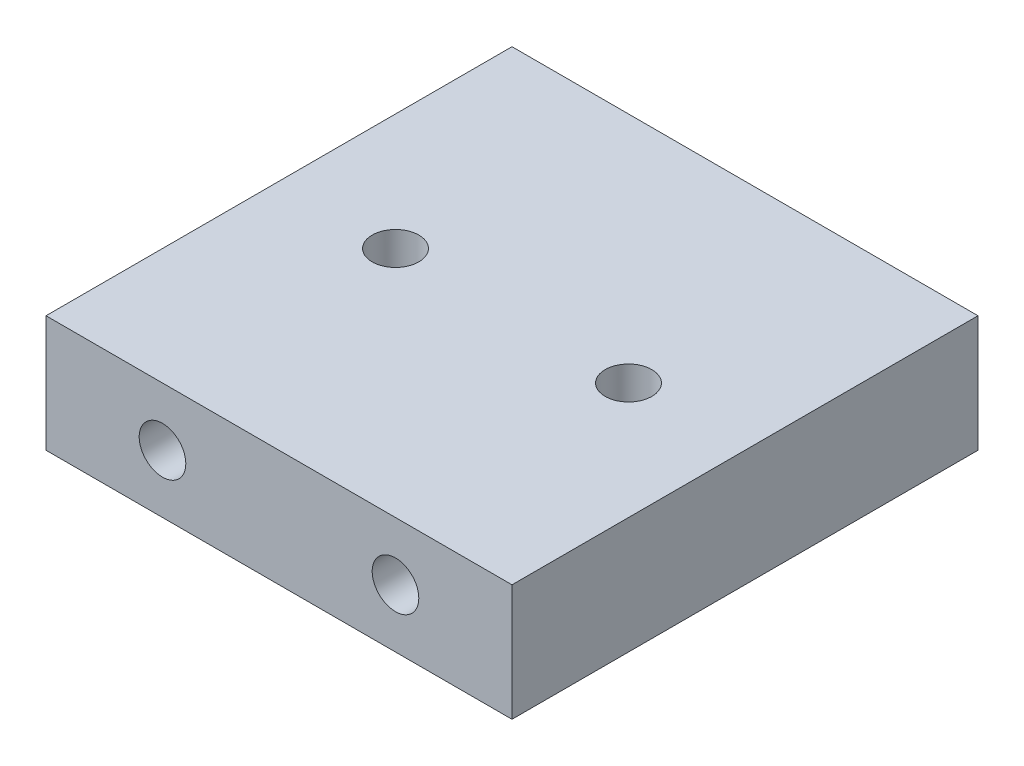
ISO-10303-21;
HEADER;
FILE_DESCRIPTION(('STEP AP214'),'2;1');
FILE_NAME('part.step','',(''),(''),'','','');
FILE_SCHEMA(('AUTOMOTIVE_DESIGN { 1 0 10303 214 1 1 1 1 }'));
ENDSEC;
DATA;
#1=APPLICATION_CONTEXT('core data for automotive mechanical design processes');
#2=APPLICATION_PROTOCOL_DEFINITION('international standard','automotive_design',2000,#1);
#3=PRODUCT_CONTEXT('',#1,'mechanical');
#4=PRODUCT('Part','Part','',(#3));
#5=PRODUCT_RELATED_PRODUCT_CATEGORY('part','',(#4));
#6=PRODUCT_DEFINITION_FORMATION('','',#4);
#7=PRODUCT_DEFINITION_CONTEXT('part definition',#1,'design');
#8=PRODUCT_DEFINITION('design','',#6,#7);
#9=PRODUCT_DEFINITION_SHAPE('','',#8);
#10=(LENGTH_UNIT() NAMED_UNIT(*) SI_UNIT(.MILLI.,.METRE.));
#11=(NAMED_UNIT(*) PLANE_ANGLE_UNIT() SI_UNIT($,.RADIAN.));
#12=(NAMED_UNIT(*) SI_UNIT($,.STERADIAN.) SOLID_ANGLE_UNIT());
#13=UNCERTAINTY_MEASURE_WITH_UNIT(LENGTH_MEASURE(1.E-05),#10,'distance_accuracy_value','');
#14=(GEOMETRIC_REPRESENTATION_CONTEXT(3) GLOBAL_UNCERTAINTY_ASSIGNED_CONTEXT((#13)) GLOBAL_UNIT_ASSIGNED_CONTEXT((#10,
#11,#12)) REPRESENTATION_CONTEXT('',''));
#15=CARTESIAN_POINT('',(0.,0.,0.));
#16=DIRECTION('',(0.,0.,1.));
#17=DIRECTION('',(1.,0.,0.));
#18=AXIS2_PLACEMENT_3D('',#15,#16,#17);
#19=CARTESIAN_POINT('',(-10.,5.,-31.));
#20=DIRECTION('',(0.,0.,1.));
#21=DIRECTION('',(1.,0.,0.));
#22=AXIS2_PLACEMENT_3D('',#19,#20,#21);
#23=CYLINDRICAL_SURFACE('',#22,2.);
#24=CARTESIAN_POINT('',(-10.,5.,20.));
#25=DIRECTION('',(0.,0.,1.));
#26=DIRECTION('',(1.,0.,0.));
#27=AXIS2_PLACEMENT_3D('',#24,#25,#26);
#28=CIRCLE('',#27,2.);
#29=CARTESIAN_POINT('',(-8.,5.,20.));
#30=VERTEX_POINT('',#29);
#31=EDGE_CURVE('E217',#30,#30,#28,.T.);
#32=ORIENTED_EDGE('',*,*,#31,.T.);
#33=EDGE_LOOP('',(#32));
#34=FACE_BOUND('',#33,.T.);
#35=CARTESIAN_POINT('',(-10.,5.,0.));
#36=DIRECTION('',(0.,0.707106781186547,0.707106781186547));
#37=DIRECTION('',(0.,-0.707106781186547,0.707106781186547));
#38=AXIS2_PLACEMENT_3D('',#35,#36,#37);
#39=ELLIPSE('',#38,2.82842712474619,2.);
#40=CARTESIAN_POINT('',(-8.,5.,0.));
#41=VERTEX_POINT('',#40);
#42=CARTESIAN_POINT('',(-12.,5.,0.));
#43=VERTEX_POINT('',#42);
#44=EDGE_CURVE('E51',#41,#43,#39,.F.);
#45=ORIENTED_EDGE('',*,*,#44,.T.);
#46=CARTESIAN_POINT('',(-10.,5.,0.));
#47=DIRECTION('',(0.,-0.707106781186547,0.707106781186547));
#48=DIRECTION('',(0.,0.707106781186547,0.707106781186547));
#49=AXIS2_PLACEMENT_3D('',#46,#47,#48);
#50=ELLIPSE('',#49,2.82842712474619,2.);
#51=EDGE_CURVE('E11',#43,#41,#50,.F.);
#52=ORIENTED_EDGE('',*,*,#51,.T.);
#53=EDGE_LOOP('',(#45,#52));
#54=FACE_BOUND('',#53,.T.);
#55=ADVANCED_FACE('F38',(#34,#54),#23,.F.);
#56=CARTESIAN_POINT('',(10.,5.,-31.));
#57=DIRECTION('',(0.,0.,1.));
#58=DIRECTION('',(1.,0.,0.));
#59=AXIS2_PLACEMENT_3D('',#56,#57,#58);
#60=CYLINDRICAL_SURFACE('',#59,2.);
#61=CARTESIAN_POINT('',(10.,5.,20.));
#62=DIRECTION('',(0.,0.,1.));
#63=DIRECTION('',(1.,0.,0.));
#64=AXIS2_PLACEMENT_3D('',#61,#62,#63);
#65=CIRCLE('',#64,2.);
#66=CARTESIAN_POINT('',(12.,5.,20.));
#67=VERTEX_POINT('',#66);
#68=EDGE_CURVE('E213',#67,#67,#65,.T.);
#69=ORIENTED_EDGE('',*,*,#68,.T.);
#70=EDGE_LOOP('',(#69));
#71=FACE_BOUND('',#70,.T.);
#72=CARTESIAN_POINT('',(10.,5.,0.));
#73=DIRECTION('',(0.,0.707106781186547,0.707106781186547));
#74=DIRECTION('',(0.,-0.707106781186547,0.707106781186547));
#75=AXIS2_PLACEMENT_3D('',#72,#73,#74);
#76=ELLIPSE('',#75,2.82842712474619,2.);
#77=CARTESIAN_POINT('',(12.,5.,0.));
#78=VERTEX_POINT('',#77);
#79=CARTESIAN_POINT('',(8.,5.,0.));
#80=VERTEX_POINT('',#79);
#81=EDGE_CURVE('E58',#78,#80,#76,.F.);
#82=ORIENTED_EDGE('',*,*,#81,.T.);
#83=CARTESIAN_POINT('',(10.,5.,0.));
#84=DIRECTION('',(0.,-0.707106781186547,0.707106781186547));
#85=DIRECTION('',(0.,0.707106781186547,0.707106781186547));
#86=AXIS2_PLACEMENT_3D('',#83,#84,#85);
#87=ELLIPSE('',#86,2.82842712474619,2.);
#88=EDGE_CURVE('E95',#80,#78,#87,.F.);
#89=ORIENTED_EDGE('',*,*,#88,.T.);
#90=EDGE_LOOP('',(#82,#89));
#91=FACE_BOUND('',#90,.T.);
#92=ADVANCED_FACE('F104',(#71,#91),#60,.F.);
#93=CARTESIAN_POINT('',(20.,10.,20.));
#94=DIRECTION('',(-1.,0.,0.));
#95=DIRECTION('',(0.,0.,1.));
#96=AXIS2_PLACEMENT_3D('',#93,#94,#95);
#97=PLANE('',#96);
#98=DIRECTION('',(0.,0.,-1.));
#99=VECTOR('',#98,1.);
#100=CARTESIAN_POINT('',(20.,0.,20.));
#101=LINE('',#100,#99);
#102=CARTESIAN_POINT('',(20.,0.,20.));
#103=VERTEX_POINT('',#102);
#104=CARTESIAN_POINT('',(20.,0.,-20.));
#105=VERTEX_POINT('',#104);
#106=EDGE_CURVE('E183',#103,#105,#101,.T.);
#107=ORIENTED_EDGE('',*,*,#106,.T.);
#108=DIRECTION('',(0.,-1.,0.));
#109=VECTOR('',#108,1.);
#110=CARTESIAN_POINT('',(20.,10.,-20.));
#111=LINE('',#110,#109);
#112=CARTESIAN_POINT('',(20.,10.,-20.));
#113=VERTEX_POINT('',#112);
#114=EDGE_CURVE('E102',#113,#105,#111,.T.);
#115=ORIENTED_EDGE('',*,*,#114,.F.);
#116=DIRECTION('',(0.,0.,-1.));
#117=VECTOR('',#116,1.);
#118=CARTESIAN_POINT('',(20.,10.,20.));
#119=LINE('',#118,#117);
#120=CARTESIAN_POINT('',(20.,10.,20.));
#121=VERTEX_POINT('',#120);
#122=EDGE_CURVE('E193',#121,#113,#119,.T.);
#123=ORIENTED_EDGE('',*,*,#122,.F.);
#124=DIRECTION('',(0.,-1.,0.));
#125=VECTOR('',#124,1.);
#126=CARTESIAN_POINT('',(20.,10.,20.));
#127=LINE('',#126,#125);
#128=EDGE_CURVE('E197',#121,#103,#127,.T.);
#129=ORIENTED_EDGE('',*,*,#128,.T.);
#130=EDGE_LOOP('',(#107,#115,#123,#129));
#131=FACE_BOUND('',#130,.T.);
#132=ADVANCED_FACE('F40',(#131),#97,.F.);
#133=CARTESIAN_POINT('',(-20.,10.,-20.));
#134=DIRECTION('',(0.,0.,1.));
#135=DIRECTION('',(1.,0.,0.));
#136=AXIS2_PLACEMENT_3D('',#133,#134,#135);
#137=PLANE('',#136);
#138=CARTESIAN_POINT('',(10.,5.,-20.));
#139=DIRECTION('',(0.,0.,1.));
#140=DIRECTION('',(1.,0.,0.));
#141=AXIS2_PLACEMENT_3D('',#138,#139,#140);
#142=CIRCLE('',#141,2.);
#143=CARTESIAN_POINT('',(12.,5.,-20.));
#144=VERTEX_POINT('',#143);
#145=EDGE_CURVE('E166',#144,#144,#142,.T.);
#146=ORIENTED_EDGE('',*,*,#145,.T.);
#147=EDGE_LOOP('',(#146));
#148=FACE_BOUND('',#147,.T.);
#149=CARTESIAN_POINT('',(-10.,5.,-20.));
#150=DIRECTION('',(0.,0.,1.));
#151=DIRECTION('',(1.,0.,0.));
#152=AXIS2_PLACEMENT_3D('',#149,#150,#151);
#153=CIRCLE('',#152,2.);
#154=CARTESIAN_POINT('',(-8.,5.,-20.));
#155=VERTEX_POINT('',#154);
#156=EDGE_CURVE('E170',#155,#155,#153,.T.);
#157=ORIENTED_EDGE('',*,*,#156,.T.);
#158=EDGE_LOOP('',(#157));
#159=FACE_BOUND('',#158,.T.);
#160=DIRECTION('',(-1.,0.,0.));
#161=VECTOR('',#160,1.);
#162=CARTESIAN_POINT('',(-20.,0.,-20.));
#163=LINE('',#162,#161);
#164=CARTESIAN_POINT('',(-20.,0.,-20.));
#165=VERTEX_POINT('',#164);
#166=EDGE_CURVE('E173',#105,#165,#163,.T.);
#167=ORIENTED_EDGE('',*,*,#166,.T.);
#168=DIRECTION('',(0.,-1.,0.));
#169=VECTOR('',#168,1.);
#170=CARTESIAN_POINT('',(-20.,10.,-20.));
#171=LINE('',#170,#169);
#172=CARTESIAN_POINT('',(-20.,10.,-20.));
#173=VERTEX_POINT('',#172);
#174=EDGE_CURVE('E175',#173,#165,#171,.T.);
#175=ORIENTED_EDGE('',*,*,#174,.F.);
#176=DIRECTION('',(-1.,0.,0.));
#177=VECTOR('',#176,1.);
#178=CARTESIAN_POINT('',(-20.,10.,-20.));
#179=LINE('',#178,#177);
#180=EDGE_CURVE('E209',#113,#173,#179,.T.);
#181=ORIENTED_EDGE('',*,*,#180,.F.);
#182=ORIENTED_EDGE('',*,*,#114,.T.);
#183=EDGE_LOOP('',(#167,#175,#181,#182));
#184=FACE_BOUND('',#183,.T.);
#185=ADVANCED_FACE('F155',(#148,#159,#184),#137,.F.);
#186=CARTESIAN_POINT('',(-20.,10.,20.));
#187=DIRECTION('',(1.,0.,0.));
#188=DIRECTION('',(0.,0.,-1.));
#189=AXIS2_PLACEMENT_3D('',#186,#187,#188);
#190=PLANE('',#189);
#191=DIRECTION('',(0.,0.,1.));
#192=VECTOR('',#191,1.);
#193=CARTESIAN_POINT('',(-20.,0.,20.));
#194=LINE('',#193,#192);
#195=CARTESIAN_POINT('',(-20.,0.,20.));
#196=VERTEX_POINT('',#195);
#197=EDGE_CURVE('E182',#165,#196,#194,.T.);
#198=ORIENTED_EDGE('',*,*,#197,.T.);
#199=DIRECTION('',(0.,-1.,0.));
#200=VECTOR('',#199,1.);
#201=CARTESIAN_POINT('',(-20.,10.,20.));
#202=LINE('',#201,#200);
#203=CARTESIAN_POINT('',(-20.,10.,20.));
#204=VERTEX_POINT('',#203);
#205=EDGE_CURVE('E188',#204,#196,#202,.T.);
#206=ORIENTED_EDGE('',*,*,#205,.F.);
#207=DIRECTION('',(0.,0.,1.));
#208=VECTOR('',#207,1.);
#209=CARTESIAN_POINT('',(-20.,10.,20.));
#210=LINE('',#209,#208);
#211=EDGE_CURVE('E187',#173,#204,#210,.T.);
#212=ORIENTED_EDGE('',*,*,#211,.F.);
#213=ORIENTED_EDGE('',*,*,#174,.T.);
#214=EDGE_LOOP('',(#198,#206,#212,#213));
#215=FACE_BOUND('',#214,.T.);
#216=ADVANCED_FACE('F152',(#215),#190,.F.);
#217=CARTESIAN_POINT('',(-20.,10.,20.));
#218=DIRECTION('',(0.,0.,-1.));
#219=DIRECTION('',(-1.,0.,0.));
#220=AXIS2_PLACEMENT_3D('',#217,#218,#219);
#221=PLANE('',#220);
#222=ORIENTED_EDGE('',*,*,#68,.F.);
#223=EDGE_LOOP('',(#222));
#224=FACE_BOUND('',#223,.T.);
#225=ORIENTED_EDGE('',*,*,#31,.F.);
#226=EDGE_LOOP('',(#225));
#227=FACE_BOUND('',#226,.T.);
#228=DIRECTION('',(1.,0.,0.));
#229=VECTOR('',#228,1.);
#230=CARTESIAN_POINT('',(-20.,0.,20.));
#231=LINE('',#230,#229);
#232=EDGE_CURVE('E191',#196,#103,#231,.T.);
#233=ORIENTED_EDGE('',*,*,#232,.T.);
#234=ORIENTED_EDGE('',*,*,#128,.F.);
#235=DIRECTION('',(1.,0.,0.));
#236=VECTOR('',#235,1.);
#237=CARTESIAN_POINT('',(-20.,10.,20.));
#238=LINE('',#237,#236);
#239=EDGE_CURVE('E200',#204,#121,#238,.T.);
#240=ORIENTED_EDGE('',*,*,#239,.F.);
#241=ORIENTED_EDGE('',*,*,#205,.T.);
#242=EDGE_LOOP('',(#233,#234,#240,#241));
#243=FACE_BOUND('',#242,.T.);
#244=ADVANCED_FACE('F145',(#224,#227,#243),#221,.F.);
#245=CARTESIAN_POINT('',(0.,10.,0.));
#246=DIRECTION('',(0.,-1.,0.));
#247=DIRECTION('',(0.,0.,-1.));
#248=AXIS2_PLACEMENT_3D('',#245,#246,#247);
#249=PLANE('',#248);
#250=CARTESIAN_POINT('',(10.,10.,0.));
#251=DIRECTION('',(0.,-1.,0.));
#252=DIRECTION('',(0.,0.,-1.));
#253=AXIS2_PLACEMENT_3D('',#250,#251,#252);
#254=CIRCLE('',#253,2.);
#255=CARTESIAN_POINT('',(10.,10.,-2.));
#256=VERTEX_POINT('',#255);
#257=EDGE_CURVE('E224',#256,#256,#254,.T.);
#258=ORIENTED_EDGE('',*,*,#257,.T.);
#259=EDGE_LOOP('',(#258));
#260=FACE_BOUND('',#259,.T.);
#261=CARTESIAN_POINT('',(-10.,10.,0.));
#262=DIRECTION('',(0.,-1.,0.));
#263=DIRECTION('',(0.,0.,-1.));
#264=AXIS2_PLACEMENT_3D('',#261,#262,#263);
#265=CIRCLE('',#264,2.);
#266=CARTESIAN_POINT('',(-10.,10.,-2.));
#267=VERTEX_POINT('',#266);
#268=EDGE_CURVE('E219',#267,#267,#265,.T.);
#269=ORIENTED_EDGE('',*,*,#268,.T.);
#270=EDGE_LOOP('',(#269));
#271=FACE_BOUND('',#270,.T.);
#272=ORIENTED_EDGE('',*,*,#122,.T.);
#273=ORIENTED_EDGE('',*,*,#180,.T.);
#274=ORIENTED_EDGE('',*,*,#211,.T.);
#275=ORIENTED_EDGE('',*,*,#239,.T.);
#276=EDGE_LOOP('',(#272,#273,#274,#275));
#277=FACE_BOUND('',#276,.T.);
#278=ADVANCED_FACE('F139',(#260,#271,#277),#249,.F.);
#279=CARTESIAN_POINT('',(0.,0.,0.));
#280=DIRECTION('',(0.,-1.,0.));
#281=DIRECTION('',(0.,0.,-1.));
#282=AXIS2_PLACEMENT_3D('',#279,#280,#281);
#283=PLANE('',#282);
#284=CARTESIAN_POINT('',(10.,0.,0.));
#285=DIRECTION('',(0.,-1.,0.));
#286=DIRECTION('',(0.,0.,-1.));
#287=AXIS2_PLACEMENT_3D('',#284,#285,#286);
#288=CIRCLE('',#287,2.);
#289=CARTESIAN_POINT('',(10.,0.,-2.));
#290=VERTEX_POINT('',#289);
#291=EDGE_CURVE('E227',#290,#290,#288,.T.);
#292=ORIENTED_EDGE('',*,*,#291,.F.);
#293=EDGE_LOOP('',(#292));
#294=FACE_BOUND('',#293,.T.);
#295=CARTESIAN_POINT('',(-10.,0.,0.));
#296=DIRECTION('',(0.,-1.,0.));
#297=DIRECTION('',(0.,0.,-1.));
#298=AXIS2_PLACEMENT_3D('',#295,#296,#297);
#299=CIRCLE('',#298,2.);
#300=CARTESIAN_POINT('',(-10.,0.,-2.));
#301=VERTEX_POINT('',#300);
#302=EDGE_CURVE('E228',#301,#301,#299,.T.);
#303=ORIENTED_EDGE('',*,*,#302,.F.);
#304=EDGE_LOOP('',(#303));
#305=FACE_BOUND('',#304,.T.);
#306=ORIENTED_EDGE('',*,*,#106,.F.);
#307=ORIENTED_EDGE('',*,*,#232,.F.);
#308=ORIENTED_EDGE('',*,*,#197,.F.);
#309=ORIENTED_EDGE('',*,*,#166,.F.);
#310=EDGE_LOOP('',(#306,#307,#308,#309));
#311=FACE_BOUND('',#310,.T.);
#312=ADVANCED_FACE('F134',(#294,#305,#311),#283,.T.);
#313=CARTESIAN_POINT('',(-10.,5.,0.));
#314=DIRECTION('',(0.,0.707106781186547,0.707106781186547));
#315=DIRECTION('',(0.,-0.707106781186547,0.707106781186547));
#316=AXIS2_PLACEMENT_3D('',#313,#314,#315);
#317=ELLIPSE('',#316,2.82842712474619,2.);
#318=EDGE_CURVE('E111',#41,#43,#317,.T.);
#319=ORIENTED_EDGE('',*,*,#318,.T.);
#320=CARTESIAN_POINT('',(-10.,5.,0.));
#321=DIRECTION('',(0.,-0.707106781186547,0.707106781186547));
#322=DIRECTION('',(0.,0.707106781186547,0.707106781186547));
#323=AXIS2_PLACEMENT_3D('',#320,#321,#322);
#324=ELLIPSE('',#323,2.82842712474619,2.);
#325=EDGE_CURVE('E46',#43,#41,#324,.T.);
#326=ORIENTED_EDGE('',*,*,#325,.T.);
#327=EDGE_LOOP('',(#319,#326));
#328=FACE_BOUND('',#327,.T.);
#329=ORIENTED_EDGE('',*,*,#156,.F.);
#330=EDGE_LOOP('',(#329));
#331=FACE_BOUND('',#330,.T.);
#332=ADVANCED_FACE('F115',(#328,#331),#23,.F.);
#333=CARTESIAN_POINT('',(10.,5.,0.));
#334=DIRECTION('',(0.,0.707106781186547,0.707106781186547));
#335=DIRECTION('',(0.,-0.707106781186547,0.707106781186547));
#336=AXIS2_PLACEMENT_3D('',#333,#334,#335);
#337=ELLIPSE('',#336,2.82842712474619,2.);
#338=EDGE_CURVE('E92',#78,#80,#337,.T.);
#339=ORIENTED_EDGE('',*,*,#338,.T.);
#340=CARTESIAN_POINT('',(10.,5.,0.));
#341=DIRECTION('',(0.,-0.707106781186547,0.707106781186547));
#342=DIRECTION('',(0.,0.707106781186547,0.707106781186547));
#343=AXIS2_PLACEMENT_3D('',#340,#341,#342);
#344=ELLIPSE('',#343,2.82842712474619,2.);
#345=EDGE_CURVE('E98',#80,#78,#344,.T.);
#346=ORIENTED_EDGE('',*,*,#345,.T.);
#347=EDGE_LOOP('',(#339,#346));
#348=FACE_BOUND('',#347,.T.);
#349=ORIENTED_EDGE('',*,*,#145,.F.);
#350=EDGE_LOOP('',(#349));
#351=FACE_BOUND('',#350,.T.);
#352=ADVANCED_FACE('F106',(#348,#351),#60,.F.);
#353=CARTESIAN_POINT('',(10.,12.,0.));
#354=DIRECTION('',(0.,-1.,0.));
#355=DIRECTION('',(0.,0.,-1.));
#356=AXIS2_PLACEMENT_3D('',#353,#354,#355);
#357=CYLINDRICAL_SURFACE('',#356,2.);
#358=ORIENTED_EDGE('',*,*,#291,.T.);
#359=EDGE_LOOP('',(#358));
#360=FACE_BOUND('',#359,.T.);
#361=ORIENTED_EDGE('',*,*,#81,.F.);
#362=ORIENTED_EDGE('',*,*,#345,.F.);
#363=EDGE_LOOP('',(#361,#362));
#364=FACE_BOUND('',#363,.T.);
#365=ADVANCED_FACE('F101',(#360,#364),#357,.F.);
#366=ORIENTED_EDGE('',*,*,#338,.F.);
#367=ORIENTED_EDGE('',*,*,#88,.F.);
#368=EDGE_LOOP('',(#366,#367));
#369=FACE_BOUND('',#368,.T.);
#370=ORIENTED_EDGE('',*,*,#257,.F.);
#371=EDGE_LOOP('',(#370));
#372=FACE_BOUND('',#371,.T.);
#373=ADVANCED_FACE('F93',(#369,#372),#357,.F.);
#374=CARTESIAN_POINT('',(-10.,12.,0.));
#375=DIRECTION('',(0.,-1.,0.));
#376=DIRECTION('',(0.,0.,-1.));
#377=AXIS2_PLACEMENT_3D('',#374,#375,#376);
#378=CYLINDRICAL_SURFACE('',#377,2.);
#379=ORIENTED_EDGE('',*,*,#302,.T.);
#380=EDGE_LOOP('',(#379));
#381=FACE_BOUND('',#380,.T.);
#382=ORIENTED_EDGE('',*,*,#44,.F.);
#383=ORIENTED_EDGE('',*,*,#325,.F.);
#384=EDGE_LOOP('',(#382,#383));
#385=FACE_BOUND('',#384,.T.);
#386=ADVANCED_FACE('F119',(#381,#385),#378,.F.);
#387=ORIENTED_EDGE('',*,*,#318,.F.);
#388=ORIENTED_EDGE('',*,*,#51,.F.);
#389=EDGE_LOOP('',(#387,#388));
#390=FACE_BOUND('',#389,.T.);
#391=ORIENTED_EDGE('',*,*,#268,.F.);
#392=EDGE_LOOP('',(#391));
#393=FACE_BOUND('',#392,.T.);
#394=ADVANCED_FACE('F121',(#390,#393),#378,.F.);
#395=CLOSED_SHELL('',(#55,#92,#132,#185,#216,#244,#278,#312,#332,#352,#365,#373,#386,#394));
#396=MANIFOLD_SOLID_BREP('B2',#395);
#397=ADVANCED_BREP_SHAPE_REPRESENTATION('',(#18,#396),#14);
#398=SHAPE_DEFINITION_REPRESENTATION(#9,#397);
ENDSEC;
END-ISO-10303-21;
